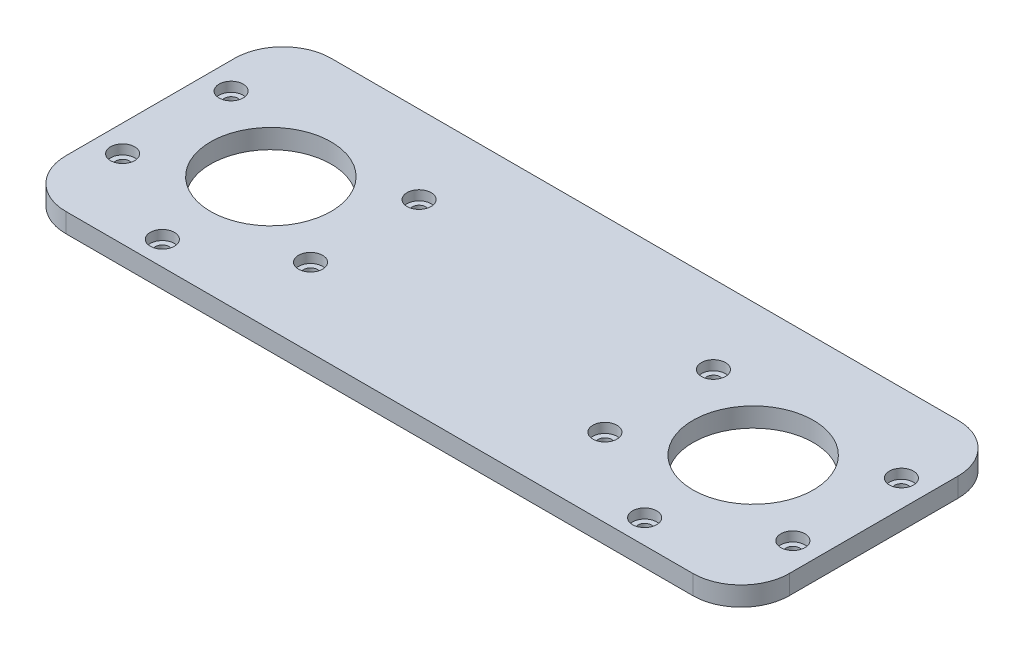
ISO-10303-21;
HEADER;
FILE_DESCRIPTION(('STEP AP214'),'2;1');
FILE_NAME('part.step','',(''),(''),'','','');
FILE_SCHEMA(('AUTOMOTIVE_DESIGN { 1 0 10303 214 1 1 1 1 }'));
ENDSEC;
DATA;
#1=APPLICATION_CONTEXT('core data for automotive mechanical design processes');
#2=APPLICATION_PROTOCOL_DEFINITION('international standard','automotive_design',2000,#1);
#3=PRODUCT_CONTEXT('',#1,'mechanical');
#4=PRODUCT('Part','Part','',(#3));
#5=PRODUCT_RELATED_PRODUCT_CATEGORY('part','',(#4));
#6=PRODUCT_DEFINITION_FORMATION('','',#4);
#7=PRODUCT_DEFINITION_CONTEXT('part definition',#1,'design');
#8=PRODUCT_DEFINITION('design','',#6,#7);
#9=PRODUCT_DEFINITION_SHAPE('','',#8);
#10=(LENGTH_UNIT() NAMED_UNIT(*) SI_UNIT(.MILLI.,.METRE.));
#11=(NAMED_UNIT(*) PLANE_ANGLE_UNIT() SI_UNIT($,.RADIAN.));
#12=(NAMED_UNIT(*) SI_UNIT($,.STERADIAN.) SOLID_ANGLE_UNIT());
#13=UNCERTAINTY_MEASURE_WITH_UNIT(LENGTH_MEASURE(1.E-05),#10,'distance_accuracy_value','');
#14=(GEOMETRIC_REPRESENTATION_CONTEXT(3) GLOBAL_UNCERTAINTY_ASSIGNED_CONTEXT((#13)) GLOBAL_UNIT_ASSIGNED_CONTEXT((#10,
#11,#12)) REPRESENTATION_CONTEXT('',''));
#15=CARTESIAN_POINT('',(0.,0.,0.));
#16=DIRECTION('',(0.,0.,1.));
#17=DIRECTION('',(1.,0.,0.));
#18=AXIS2_PLACEMENT_3D('',#15,#16,#17);
#19=CARTESIAN_POINT('',(-30.5144284148501,0.,-11.25));
#20=DIRECTION('',(0.,1.,0.));
#21=DIRECTION('',(0.,0.,1.));
#22=AXIS2_PLACEMENT_3D('',#19,#20,#21);
#23=CYLINDRICAL_SURFACE('',#22,1.4);
#24=CARTESIAN_POINT('',(-30.5144284148501,0.,-11.25));
#25=DIRECTION('',(0.,-1.,0.));
#26=DIRECTION('',(0.,0.,1.));
#27=AXIS2_PLACEMENT_3D('',#24,#25,#26);
#28=CIRCLE('',#27,1.4);
#29=CARTESIAN_POINT('',(-30.5144284148501,0.,-9.85000000000001));
#30=VERTEX_POINT('',#29);
#31=EDGE_CURVE('E251',#30,#30,#28,.T.);
#32=ORIENTED_EDGE('',*,*,#31,.T.);
#33=EDGE_LOOP('',(#32));
#34=FACE_BOUND('',#33,.T.);
#35=CARTESIAN_POINT('',(-30.5144284148501,2.,-11.25));
#36=DIRECTION('',(0.,1.,0.));
#37=DIRECTION('',(0.,0.,1.));
#38=AXIS2_PLACEMENT_3D('',#35,#36,#37);
#39=CIRCLE('',#38,1.4);
#40=CARTESIAN_POINT('',(-30.5144284148501,2.,-9.85000000000001));
#41=VERTEX_POINT('',#40);
#42=EDGE_CURVE('E175',#41,#41,#39,.T.);
#43=ORIENTED_EDGE('',*,*,#42,.T.);
#44=EDGE_LOOP('',(#43));
#45=FACE_BOUND('',#44,.T.);
#46=ADVANCED_FACE('F43',(#34,#45),#23,.F.);
#47=CARTESIAN_POINT('',(-69.4855715851498,0.,-11.2500000000001));
#48=DIRECTION('',(0.,1.,0.));
#49=DIRECTION('',(0.,0.,1.));
#50=AXIS2_PLACEMENT_3D('',#47,#48,#49);
#51=CYLINDRICAL_SURFACE('',#50,1.4);
#52=CARTESIAN_POINT('',(-69.4855715851498,0.,-11.2500000000001));
#53=DIRECTION('',(0.,-1.,0.));
#54=DIRECTION('',(0.,0.,1.));
#55=AXIS2_PLACEMENT_3D('',#52,#53,#54);
#56=CIRCLE('',#55,1.4);
#57=CARTESIAN_POINT('',(-69.4855715851498,0.,-9.85000000000013));
#58=VERTEX_POINT('',#57);
#59=EDGE_CURVE('E273',#58,#58,#56,.T.);
#60=ORIENTED_EDGE('',*,*,#59,.T.);
#61=EDGE_LOOP('',(#60));
#62=FACE_BOUND('',#61,.T.);
#63=CARTESIAN_POINT('',(-69.4855715851498,2.,-11.2500000000001));
#64=DIRECTION('',(0.,1.,0.));
#65=DIRECTION('',(0.,0.,1.));
#66=AXIS2_PLACEMENT_3D('',#63,#64,#65);
#67=CIRCLE('',#66,1.4);
#68=CARTESIAN_POINT('',(-69.4855715851498,2.,-9.85000000000013));
#69=VERTEX_POINT('',#68);
#70=EDGE_CURVE('E172',#69,#69,#67,.T.);
#71=ORIENTED_EDGE('',*,*,#70,.T.);
#72=EDGE_LOOP('',(#71));
#73=FACE_BOUND('',#72,.T.);
#74=ADVANCED_FACE('F333',(#62,#73),#51,.F.);
#75=CARTESIAN_POINT('',(-69.4855715851499,0.,11.2500000000001));
#76=DIRECTION('',(0.,1.,0.));
#77=DIRECTION('',(0.,0.,1.));
#78=AXIS2_PLACEMENT_3D('',#75,#76,#77);
#79=CYLINDRICAL_SURFACE('',#78,1.4);
#80=CARTESIAN_POINT('',(-69.4855715851499,0.,11.2500000000001));
#81=DIRECTION('',(0.,-1.,0.));
#82=DIRECTION('',(0.,0.,1.));
#83=AXIS2_PLACEMENT_3D('',#80,#81,#82);
#84=CIRCLE('',#83,1.4);
#85=CARTESIAN_POINT('',(-69.4855715851499,0.,12.6500000000001));
#86=VERTEX_POINT('',#85);
#87=EDGE_CURVE('E279',#86,#86,#84,.T.);
#88=ORIENTED_EDGE('',*,*,#87,.T.);
#89=EDGE_LOOP('',(#88));
#90=FACE_BOUND('',#89,.T.);
#91=CARTESIAN_POINT('',(-69.4855715851499,2.,11.2500000000001));
#92=DIRECTION('',(0.,1.,0.));
#93=DIRECTION('',(0.,0.,1.));
#94=AXIS2_PLACEMENT_3D('',#91,#92,#93);
#95=CIRCLE('',#94,1.4);
#96=CARTESIAN_POINT('',(-69.4855715851499,2.,12.6500000000001));
#97=VERTEX_POINT('',#96);
#98=EDGE_CURVE('E169',#97,#97,#95,.T.);
#99=ORIENTED_EDGE('',*,*,#98,.T.);
#100=EDGE_LOOP('',(#99));
#101=FACE_BOUND('',#100,.T.);
#102=ADVANCED_FACE('F340',(#90,#101),#79,.F.);
#103=CARTESIAN_POINT('',(-30.5144284148501,0.,11.25));
#104=DIRECTION('',(0.,1.,0.));
#105=DIRECTION('',(0.,0.,1.));
#106=AXIS2_PLACEMENT_3D('',#103,#104,#105);
#107=CYLINDRICAL_SURFACE('',#106,1.4);
#108=CARTESIAN_POINT('',(-30.5144284148501,0.,11.25));
#109=DIRECTION('',(0.,-1.,0.));
#110=DIRECTION('',(0.,0.,1.));
#111=AXIS2_PLACEMENT_3D('',#108,#109,#110);
#112=CIRCLE('',#111,1.4);
#113=CARTESIAN_POINT('',(-30.5144284148501,0.,12.65));
#114=VERTEX_POINT('',#113);
#115=EDGE_CURVE('E276',#114,#114,#112,.T.);
#116=ORIENTED_EDGE('',*,*,#115,.T.);
#117=EDGE_LOOP('',(#116));
#118=FACE_BOUND('',#117,.T.);
#119=CARTESIAN_POINT('',(-30.5144284148501,2.,11.25));
#120=DIRECTION('',(0.,1.,0.));
#121=DIRECTION('',(0.,0.,1.));
#122=AXIS2_PLACEMENT_3D('',#119,#120,#121);
#123=CIRCLE('',#122,1.4);
#124=CARTESIAN_POINT('',(-30.5144284148501,2.,12.65));
#125=VERTEX_POINT('',#124);
#126=EDGE_CURVE('E165',#125,#125,#123,.T.);
#127=ORIENTED_EDGE('',*,*,#126,.T.);
#128=EDGE_LOOP('',(#127));
#129=FACE_BOUND('',#128,.T.);
#130=ADVANCED_FACE('F603',(#118,#129),#107,.F.);
#131=CARTESIAN_POINT('',(-50.,0.,22.5));
#132=DIRECTION('',(0.,1.,0.));
#133=DIRECTION('',(0.,0.,1.));
#134=AXIS2_PLACEMENT_3D('',#131,#132,#133);
#135=CYLINDRICAL_SURFACE('',#134,1.4);
#136=CARTESIAN_POINT('',(-50.,0.,22.5));
#137=DIRECTION('',(0.,-1.,0.));
#138=DIRECTION('',(0.,0.,1.));
#139=AXIS2_PLACEMENT_3D('',#136,#137,#138);
#140=CIRCLE('',#139,1.4);
#141=CARTESIAN_POINT('',(-50.,0.,23.9));
#142=VERTEX_POINT('',#141);
#143=EDGE_CURVE('E178',#142,#142,#140,.T.);
#144=ORIENTED_EDGE('',*,*,#143,.T.);
#145=EDGE_LOOP('',(#144));
#146=FACE_BOUND('',#145,.T.);
#147=CARTESIAN_POINT('',(-50.,2.,22.5));
#148=DIRECTION('',(0.,1.,0.));
#149=DIRECTION('',(0.,0.,1.));
#150=AXIS2_PLACEMENT_3D('',#147,#148,#149);
#151=CIRCLE('',#150,1.4);
#152=CARTESIAN_POINT('',(-50.,2.,23.9));
#153=VERTEX_POINT('',#152);
#154=EDGE_CURVE('E162',#153,#153,#151,.T.);
#155=ORIENTED_EDGE('',*,*,#154,.T.);
#156=EDGE_LOOP('',(#155));
#157=FACE_BOUND('',#156,.T.);
#158=ADVANCED_FACE('F346',(#146,#157),#135,.F.);
#159=CARTESIAN_POINT('',(30.5144284148501,0.,-11.25));
#160=DIRECTION('',(0.,1.,0.));
#161=DIRECTION('',(0.,0.,1.));
#162=AXIS2_PLACEMENT_3D('',#159,#160,#161);
#163=CYLINDRICAL_SURFACE('',#162,1.4);
#164=CARTESIAN_POINT('',(30.5144284148501,0.,-11.25));
#165=DIRECTION('',(0.,1.,0.));
#166=DIRECTION('',(0.,0.,1.));
#167=AXIS2_PLACEMENT_3D('',#164,#165,#166);
#168=CIRCLE('',#167,1.4);
#169=CARTESIAN_POINT('',(30.5144284148501,0.,-9.85000000000001));
#170=VERTEX_POINT('',#169);
#171=EDGE_CURVE('E225',#170,#170,#168,.T.);
#172=ORIENTED_EDGE('',*,*,#171,.F.);
#173=EDGE_LOOP('',(#172));
#174=FACE_BOUND('',#173,.T.);
#175=CARTESIAN_POINT('',(30.5144284148501,2.,-11.25));
#176=DIRECTION('',(0.,1.,0.));
#177=DIRECTION('',(0.,0.,1.));
#178=AXIS2_PLACEMENT_3D('',#175,#176,#177);
#179=CIRCLE('',#178,1.4);
#180=CARTESIAN_POINT('',(30.5144284148501,2.,-9.85000000000001));
#181=VERTEX_POINT('',#180);
#182=EDGE_CURVE('E158',#181,#181,#179,.F.);
#183=ORIENTED_EDGE('',*,*,#182,.F.);
#184=EDGE_LOOP('',(#183));
#185=FACE_BOUND('',#184,.T.);
#186=ADVANCED_FACE('F393',(#174,#185),#163,.F.);
#187=CARTESIAN_POINT('',(69.4855715851498,0.,-11.2500000000001));
#188=DIRECTION('',(0.,1.,0.));
#189=DIRECTION('',(0.,0.,1.));
#190=AXIS2_PLACEMENT_3D('',#187,#188,#189);
#191=CYLINDRICAL_SURFACE('',#190,1.4);
#192=CARTESIAN_POINT('',(69.4855715851498,0.,-11.2500000000001));
#193=DIRECTION('',(0.,1.,0.));
#194=DIRECTION('',(0.,0.,1.));
#195=AXIS2_PLACEMENT_3D('',#192,#193,#194);
#196=CIRCLE('',#195,1.4);
#197=CARTESIAN_POINT('',(69.4855715851498,0.,-9.85000000000013));
#198=VERTEX_POINT('',#197);
#199=EDGE_CURVE('E230',#198,#198,#196,.T.);
#200=ORIENTED_EDGE('',*,*,#199,.F.);
#201=EDGE_LOOP('',(#200));
#202=FACE_BOUND('',#201,.T.);
#203=CARTESIAN_POINT('',(69.4855715851498,2.,-11.2500000000001));
#204=DIRECTION('',(0.,1.,0.));
#205=DIRECTION('',(0.,0.,1.));
#206=AXIS2_PLACEMENT_3D('',#203,#204,#205);
#207=CIRCLE('',#206,1.4);
#208=CARTESIAN_POINT('',(69.4855715851498,2.,-9.85000000000013));
#209=VERTEX_POINT('',#208);
#210=EDGE_CURVE('E155',#209,#209,#207,.F.);
#211=ORIENTED_EDGE('',*,*,#210,.F.);
#212=EDGE_LOOP('',(#211));
#213=FACE_BOUND('',#212,.T.);
#214=ADVANCED_FACE('F389',(#202,#213),#191,.F.);
#215=CARTESIAN_POINT('',(69.4855715851499,0.,11.2500000000001));
#216=DIRECTION('',(0.,1.,0.));
#217=DIRECTION('',(0.,0.,1.));
#218=AXIS2_PLACEMENT_3D('',#215,#216,#217);
#219=CYLINDRICAL_SURFACE('',#218,1.4);
#220=CARTESIAN_POINT('',(69.4855715851499,0.,11.2500000000001));
#221=DIRECTION('',(0.,1.,0.));
#222=DIRECTION('',(0.,0.,1.));
#223=AXIS2_PLACEMENT_3D('',#220,#221,#222);
#224=CIRCLE('',#223,1.4);
#225=CARTESIAN_POINT('',(69.4855715851499,0.,12.6500000000001));
#226=VERTEX_POINT('',#225);
#227=EDGE_CURVE('E236',#226,#226,#224,.T.);
#228=ORIENTED_EDGE('',*,*,#227,.F.);
#229=EDGE_LOOP('',(#228));
#230=FACE_BOUND('',#229,.T.);
#231=CARTESIAN_POINT('',(69.4855715851499,2.,11.2500000000001));
#232=DIRECTION('',(0.,1.,0.));
#233=DIRECTION('',(0.,0.,1.));
#234=AXIS2_PLACEMENT_3D('',#231,#232,#233);
#235=CIRCLE('',#234,1.4);
#236=CARTESIAN_POINT('',(69.4855715851499,2.,12.6500000000001));
#237=VERTEX_POINT('',#236);
#238=EDGE_CURVE('E152',#237,#237,#235,.F.);
#239=ORIENTED_EDGE('',*,*,#238,.F.);
#240=EDGE_LOOP('',(#239));
#241=FACE_BOUND('',#240,.T.);
#242=ADVANCED_FACE('F392',(#230,#241),#219,.F.);
#243=CARTESIAN_POINT('',(30.5144284148501,0.,11.25));
#244=DIRECTION('',(0.,1.,0.));
#245=DIRECTION('',(0.,0.,1.));
#246=AXIS2_PLACEMENT_3D('',#243,#244,#245);
#247=CYLINDRICAL_SURFACE('',#246,1.4);
#248=CARTESIAN_POINT('',(30.5144284148501,0.,11.25));
#249=DIRECTION('',(0.,1.,0.));
#250=DIRECTION('',(0.,0.,1.));
#251=AXIS2_PLACEMENT_3D('',#248,#249,#250);
#252=CIRCLE('',#251,1.4);
#253=CARTESIAN_POINT('',(30.5144284148501,0.,12.65));
#254=VERTEX_POINT('',#253);
#255=EDGE_CURVE('E233',#254,#254,#252,.T.);
#256=ORIENTED_EDGE('',*,*,#255,.F.);
#257=EDGE_LOOP('',(#256));
#258=FACE_BOUND('',#257,.T.);
#259=CARTESIAN_POINT('',(30.5144284148501,2.,11.25));
#260=DIRECTION('',(0.,1.,0.));
#261=DIRECTION('',(0.,0.,1.));
#262=AXIS2_PLACEMENT_3D('',#259,#260,#261);
#263=CIRCLE('',#262,1.4);
#264=CARTESIAN_POINT('',(30.5144284148501,2.,12.65));
#265=VERTEX_POINT('',#264);
#266=EDGE_CURVE('E148',#265,#265,#263,.F.);
#267=ORIENTED_EDGE('',*,*,#266,.F.);
#268=EDGE_LOOP('',(#267));
#269=FACE_BOUND('',#268,.T.);
#270=ADVANCED_FACE('F397',(#258,#269),#247,.F.);
#271=CARTESIAN_POINT('',(50.,0.,22.5));
#272=DIRECTION('',(0.,1.,0.));
#273=DIRECTION('',(0.,0.,1.));
#274=AXIS2_PLACEMENT_3D('',#271,#272,#273);
#275=CYLINDRICAL_SURFACE('',#274,1.4);
#276=CARTESIAN_POINT('',(50.,0.,22.5));
#277=DIRECTION('',(0.,1.,0.));
#278=DIRECTION('',(0.,0.,1.));
#279=AXIS2_PLACEMENT_3D('',#276,#277,#278);
#280=CIRCLE('',#279,1.4);
#281=CARTESIAN_POINT('',(50.,0.,23.9));
#282=VERTEX_POINT('',#281);
#283=EDGE_CURVE('E161',#282,#282,#280,.T.);
#284=ORIENTED_EDGE('',*,*,#283,.F.);
#285=EDGE_LOOP('',(#284));
#286=FACE_BOUND('',#285,.T.);
#287=CARTESIAN_POINT('',(50.,2.,22.5));
#288=DIRECTION('',(0.,1.,0.));
#289=DIRECTION('',(0.,0.,1.));
#290=AXIS2_PLACEMENT_3D('',#287,#288,#289);
#291=CIRCLE('',#290,1.4);
#292=CARTESIAN_POINT('',(50.,2.,23.9));
#293=VERTEX_POINT('',#292);
#294=EDGE_CURVE('E145',#293,#293,#291,.F.);
#295=ORIENTED_EDGE('',*,*,#294,.F.);
#296=EDGE_LOOP('',(#295));
#297=FACE_BOUND('',#296,.T.);
#298=ADVANCED_FACE('F401',(#286,#297),#275,.F.);
#299=CARTESIAN_POINT('',(0.,4.,0.));
#300=DIRECTION('',(0.,1.,0.));
#301=DIRECTION('',(0.,0.,1.));
#302=AXIS2_PLACEMENT_3D('',#299,#300,#301);
#303=PLANE('',#302);
#304=CARTESIAN_POINT('',(-69.4855715851498,4.,-11.2500000000001));
#305=DIRECTION('',(0.,-1.,0.));
#306=DIRECTION('',(0.,0.,1.));
#307=AXIS2_PLACEMENT_3D('',#304,#305,#306);
#308=CIRCLE('',#307,2.5);
#309=CARTESIAN_POINT('',(-69.4855715851498,4.,-8.75000000000014));
#310=VERTEX_POINT('',#309);
#311=EDGE_CURVE('E290',#310,#310,#308,.T.);
#312=ORIENTED_EDGE('',*,*,#311,.T.);
#313=EDGE_LOOP('',(#312));
#314=FACE_BOUND('',#313,.T.);
#315=CARTESIAN_POINT('',(-69.4855715851499,4.,11.2500000000001));
#316=DIRECTION('',(0.,-1.,0.));
#317=DIRECTION('',(0.,0.,1.));
#318=AXIS2_PLACEMENT_3D('',#315,#316,#317);
#319=CIRCLE('',#318,2.50000000000001);
#320=CARTESIAN_POINT('',(-69.4855715851499,4.,13.7500000000001));
#321=VERTEX_POINT('',#320);
#322=EDGE_CURVE('E296',#321,#321,#319,.T.);
#323=ORIENTED_EDGE('',*,*,#322,.T.);
#324=EDGE_LOOP('',(#323));
#325=FACE_BOUND('',#324,.T.);
#326=CARTESIAN_POINT('',(-50.,4.,22.5));
#327=DIRECTION('',(0.,-1.,0.));
#328=DIRECTION('',(0.,0.,1.));
#329=AXIS2_PLACEMENT_3D('',#326,#327,#328);
#330=CIRCLE('',#329,2.5);
#331=CARTESIAN_POINT('',(-50.,4.,25.));
#332=VERTEX_POINT('',#331);
#333=EDGE_CURVE('E302',#332,#332,#330,.T.);
#334=ORIENTED_EDGE('',*,*,#333,.T.);
#335=EDGE_LOOP('',(#334));
#336=FACE_BOUND('',#335,.T.);
#337=CARTESIAN_POINT('',(-30.5144284148501,4.,11.25));
#338=DIRECTION('',(0.,-1.,0.));
#339=DIRECTION('',(0.,0.,1.));
#340=AXIS2_PLACEMENT_3D('',#337,#338,#339);
#341=CIRCLE('',#340,2.5);
#342=CARTESIAN_POINT('',(-30.5144284148501,4.,13.75));
#343=VERTEX_POINT('',#342);
#344=EDGE_CURVE('E308',#343,#343,#341,.T.);
#345=ORIENTED_EDGE('',*,*,#344,.T.);
#346=EDGE_LOOP('',(#345));
#347=FACE_BOUND('',#346,.T.);
#348=CARTESIAN_POINT('',(-30.5144284148501,4.,-11.25));
#349=DIRECTION('',(0.,-1.,0.));
#350=DIRECTION('',(0.,0.,1.));
#351=AXIS2_PLACEMENT_3D('',#348,#349,#350);
#352=CIRCLE('',#351,2.5);
#353=CARTESIAN_POINT('',(-30.5144284148501,4.,-8.75000000000001));
#354=VERTEX_POINT('',#353);
#355=EDGE_CURVE('E284',#354,#354,#352,.T.);
#356=ORIENTED_EDGE('',*,*,#355,.T.);
#357=EDGE_LOOP('',(#356));
#358=FACE_BOUND('',#357,.T.);
#359=CARTESIAN_POINT('',(69.4855715851498,4.,-11.2500000000001));
#360=DIRECTION('',(0.,1.,0.));
#361=DIRECTION('',(0.,0.,1.));
#362=AXIS2_PLACEMENT_3D('',#359,#360,#361);
#363=CIRCLE('',#362,2.5);
#364=CARTESIAN_POINT('',(69.4855715851498,4.,-8.75000000000014));
#365=VERTEX_POINT('',#364);
#366=EDGE_CURVE('E250',#365,#365,#363,.T.);
#367=ORIENTED_EDGE('',*,*,#366,.F.);
#368=EDGE_LOOP('',(#367));
#369=FACE_BOUND('',#368,.T.);
#370=CARTESIAN_POINT('',(69.4855715851499,4.,11.2500000000001));
#371=DIRECTION('',(0.,1.,0.));
#372=DIRECTION('',(0.,0.,1.));
#373=AXIS2_PLACEMENT_3D('',#370,#371,#372);
#374=CIRCLE('',#373,2.50000000000001);
#375=CARTESIAN_POINT('',(69.4855715851499,4.,13.7500000000001));
#376=VERTEX_POINT('',#375);
#377=EDGE_CURVE('E257',#376,#376,#374,.T.);
#378=ORIENTED_EDGE('',*,*,#377,.F.);
#379=EDGE_LOOP('',(#378));
#380=FACE_BOUND('',#379,.T.);
#381=CARTESIAN_POINT('',(50.,4.,22.5));
#382=DIRECTION('',(0.,1.,0.));
#383=DIRECTION('',(0.,0.,1.));
#384=AXIS2_PLACEMENT_3D('',#381,#382,#383);
#385=CIRCLE('',#384,2.5);
#386=CARTESIAN_POINT('',(50.,4.,25.));
#387=VERTEX_POINT('',#386);
#388=EDGE_CURVE('E263',#387,#387,#385,.T.);
#389=ORIENTED_EDGE('',*,*,#388,.F.);
#390=EDGE_LOOP('',(#389));
#391=FACE_BOUND('',#390,.T.);
#392=CARTESIAN_POINT('',(30.5144284148501,4.,11.25));
#393=DIRECTION('',(0.,1.,0.));
#394=DIRECTION('',(0.,0.,1.));
#395=AXIS2_PLACEMENT_3D('',#392,#393,#394);
#396=CIRCLE('',#395,2.5);
#397=CARTESIAN_POINT('',(30.5144284148501,4.,13.75));
#398=VERTEX_POINT('',#397);
#399=EDGE_CURVE('E244',#398,#398,#396,.T.);
#400=ORIENTED_EDGE('',*,*,#399,.F.);
#401=EDGE_LOOP('',(#400));
#402=FACE_BOUND('',#401,.T.);
#403=CARTESIAN_POINT('',(30.5144284148501,4.,-11.25));
#404=DIRECTION('',(0.,1.,0.));
#405=DIRECTION('',(0.,0.,1.));
#406=AXIS2_PLACEMENT_3D('',#403,#404,#405);
#407=CIRCLE('',#406,2.5);
#408=CARTESIAN_POINT('',(30.5144284148501,4.,-8.75000000000001));
#409=VERTEX_POINT('',#408);
#410=EDGE_CURVE('E241',#409,#409,#407,.T.);
#411=ORIENTED_EDGE('',*,*,#410,.F.);
#412=EDGE_LOOP('',(#411));
#413=FACE_BOUND('',#412,.T.);
#414=CARTESIAN_POINT('',(-50.,4.,0.));
#415=DIRECTION('',(0.,1.,0.));
#416=DIRECTION('',(0.,0.,1.));
#417=AXIS2_PLACEMENT_3D('',#414,#415,#416);
#418=CIRCLE('',#417,12.5);
#419=CARTESIAN_POINT('',(-50.,4.,12.5));
#420=VERTEX_POINT('',#419);
#421=EDGE_CURVE('E208',#420,#420,#418,.T.);
#422=ORIENTED_EDGE('',*,*,#421,.F.);
#423=EDGE_LOOP('',(#422));
#424=FACE_BOUND('',#423,.T.);
#425=DIRECTION('',(0.,0.,-1.));
#426=VECTOR('',#425,1.);
#427=CARTESIAN_POINT('',(75.,4.,-27.5));
#428=LINE('',#427,#426);
#429=CARTESIAN_POINT('',(75.,4.,17.5));
#430=VERTEX_POINT('',#429);
#431=CARTESIAN_POINT('',(75.,4.,-17.5));
#432=VERTEX_POINT('',#431);
#433=EDGE_CURVE('E215',#430,#432,#428,.T.);
#434=ORIENTED_EDGE('',*,*,#433,.T.);
#435=CARTESIAN_POINT('',(65.,4.,-17.5));
#436=DIRECTION('',(0.,1.,0.));
#437=DIRECTION('',(0.,0.,1.));
#438=AXIS2_PLACEMENT_3D('',#435,#436,#437);
#439=CIRCLE('',#438,10.);
#440=CARTESIAN_POINT('',(65.,4.,-27.5));
#441=VERTEX_POINT('',#440);
#442=EDGE_CURVE('E192',#432,#441,#439,.T.);
#443=ORIENTED_EDGE('',*,*,#442,.T.);
#444=DIRECTION('',(-1.,0.,0.));
#445=VECTOR('',#444,1.);
#446=CARTESIAN_POINT('',(-75.,4.,-27.5));
#447=LINE('',#446,#445);
#448=CARTESIAN_POINT('',(-65.,4.,-27.5));
#449=VERTEX_POINT('',#448);
#450=EDGE_CURVE('E129',#441,#449,#447,.T.);
#451=ORIENTED_EDGE('',*,*,#450,.T.);
#452=CARTESIAN_POINT('',(-65.,4.,-17.5));
#453=DIRECTION('',(0.,1.,0.));
#454=DIRECTION('',(0.,0.,1.));
#455=AXIS2_PLACEMENT_3D('',#452,#453,#454);
#456=CIRCLE('',#455,10.);
#457=CARTESIAN_POINT('',(-75.,4.,-17.5));
#458=VERTEX_POINT('',#457);
#459=EDGE_CURVE('E187',#449,#458,#456,.T.);
#460=ORIENTED_EDGE('',*,*,#459,.T.);
#461=DIRECTION('',(0.,0.,1.));
#462=VECTOR('',#461,1.);
#463=CARTESIAN_POINT('',(-75.,4.,-27.5));
#464=LINE('',#463,#462);
#465=CARTESIAN_POINT('',(-75.,4.,17.5));
#466=VERTEX_POINT('',#465);
#467=EDGE_CURVE('E136',#458,#466,#464,.T.);
#468=ORIENTED_EDGE('',*,*,#467,.T.);
#469=CARTESIAN_POINT('',(-65.,4.,17.5));
#470=DIRECTION('',(0.,1.,0.));
#471=DIRECTION('',(0.,0.,1.));
#472=AXIS2_PLACEMENT_3D('',#469,#470,#471);
#473=CIRCLE('',#472,10.);
#474=CARTESIAN_POINT('',(-65.,4.,27.5));
#475=VERTEX_POINT('',#474);
#476=EDGE_CURVE('E65',#466,#475,#473,.T.);
#477=ORIENTED_EDGE('',*,*,#476,.T.);
#478=DIRECTION('',(1.,0.,0.));
#479=VECTOR('',#478,1.);
#480=CARTESIAN_POINT('',(-75.,4.,27.5));
#481=LINE('',#480,#479);
#482=CARTESIAN_POINT('',(65.,4.,27.5));
#483=VERTEX_POINT('',#482);
#484=EDGE_CURVE('E139',#475,#483,#481,.T.);
#485=ORIENTED_EDGE('',*,*,#484,.T.);
#486=CARTESIAN_POINT('',(65.,4.,17.5));
#487=DIRECTION('',(0.,1.,0.));
#488=DIRECTION('',(0.,0.,1.));
#489=AXIS2_PLACEMENT_3D('',#486,#487,#488);
#490=CIRCLE('',#489,10.);
#491=EDGE_CURVE('E190',#483,#430,#490,.T.);
#492=ORIENTED_EDGE('',*,*,#491,.T.);
#493=EDGE_LOOP('',(#434,#443,#451,#460,#468,#477,#485,#492));
#494=FACE_BOUND('',#493,.T.);
#495=CARTESIAN_POINT('',(50.,4.,0.));
#496=DIRECTION('',(0.,1.,0.));
#497=DIRECTION('',(0.,0.,1.));
#498=AXIS2_PLACEMENT_3D('',#495,#496,#497);
#499=CIRCLE('',#498,12.5);
#500=CARTESIAN_POINT('',(50.,4.,12.5));
#501=VERTEX_POINT('',#500);
#502=EDGE_CURVE('E220',#501,#501,#499,.T.);
#503=ORIENTED_EDGE('',*,*,#502,.F.);
#504=EDGE_LOOP('',(#503));
#505=FACE_BOUND('',#504,.T.);
#506=ADVANCED_FACE('F405',(#314,#325,#336,#347,#358,#369,#380,#391,#402,#413,#424,#494,#505),
#303,.T.);
#507=CARTESIAN_POINT('',(0.,0.,0.));
#508=DIRECTION('',(0.,1.,0.));
#509=DIRECTION('',(0.,0.,1.));
#510=AXIS2_PLACEMENT_3D('',#507,#508,#509);
#511=PLANE('',#510);
#512=ORIENTED_EDGE('',*,*,#143,.F.);
#513=EDGE_LOOP('',(#512));
#514=FACE_BOUND('',#513,.T.);
#515=ORIENTED_EDGE('',*,*,#115,.F.);
#516=EDGE_LOOP('',(#515));
#517=FACE_BOUND('',#516,.T.);
#518=ORIENTED_EDGE('',*,*,#87,.F.);
#519=EDGE_LOOP('',(#518));
#520=FACE_BOUND('',#519,.T.);
#521=ORIENTED_EDGE('',*,*,#59,.F.);
#522=EDGE_LOOP('',(#521));
#523=FACE_BOUND('',#522,.T.);
#524=ORIENTED_EDGE('',*,*,#31,.F.);
#525=EDGE_LOOP('',(#524));
#526=FACE_BOUND('',#525,.T.);
#527=ORIENTED_EDGE('',*,*,#283,.T.);
#528=EDGE_LOOP('',(#527));
#529=FACE_BOUND('',#528,.T.);
#530=ORIENTED_EDGE('',*,*,#255,.T.);
#531=EDGE_LOOP('',(#530));
#532=FACE_BOUND('',#531,.T.);
#533=ORIENTED_EDGE('',*,*,#227,.T.);
#534=EDGE_LOOP('',(#533));
#535=FACE_BOUND('',#534,.T.);
#536=ORIENTED_EDGE('',*,*,#199,.T.);
#537=EDGE_LOOP('',(#536));
#538=FACE_BOUND('',#537,.T.);
#539=ORIENTED_EDGE('',*,*,#171,.T.);
#540=EDGE_LOOP('',(#539));
#541=FACE_BOUND('',#540,.T.);
#542=DIRECTION('',(-1.,0.,0.));
#543=VECTOR('',#542,1.);
#544=CARTESIAN_POINT('',(-75.,0.,-27.5));
#545=LINE('',#544,#543);
#546=CARTESIAN_POINT('',(65.,0.,-27.5));
#547=VERTEX_POINT('',#546);
#548=CARTESIAN_POINT('',(-65.,0.,-27.5));
#549=VERTEX_POINT('',#548);
#550=EDGE_CURVE('E126',#547,#549,#545,.T.);
#551=ORIENTED_EDGE('',*,*,#550,.F.);
#552=CARTESIAN_POINT('',(65.,0.,-17.5));
#553=DIRECTION('',(0.,1.,0.));
#554=DIRECTION('',(0.,0.,1.));
#555=AXIS2_PLACEMENT_3D('',#552,#553,#554);
#556=CIRCLE('',#555,10.);
#557=CARTESIAN_POINT('',(75.,0.,-17.5));
#558=VERTEX_POINT('',#557);
#559=EDGE_CURVE('E109',#547,#558,#556,.F.);
#560=ORIENTED_EDGE('',*,*,#559,.T.);
#561=DIRECTION('',(0.,0.,-1.));
#562=VECTOR('',#561,1.);
#563=CARTESIAN_POINT('',(75.,0.,-27.5));
#564=LINE('',#563,#562);
#565=CARTESIAN_POINT('',(75.,0.,17.5));
#566=VERTEX_POINT('',#565);
#567=EDGE_CURVE('E137',#566,#558,#564,.T.);
#568=ORIENTED_EDGE('',*,*,#567,.F.);
#569=CARTESIAN_POINT('',(65.,0.,17.5));
#570=DIRECTION('',(0.,1.,0.));
#571=DIRECTION('',(0.,0.,1.));
#572=AXIS2_PLACEMENT_3D('',#569,#570,#571);
#573=CIRCLE('',#572,10.);
#574=CARTESIAN_POINT('',(65.,0.,27.5));
#575=VERTEX_POINT('',#574);
#576=EDGE_CURVE('E120',#566,#575,#573,.F.);
#577=ORIENTED_EDGE('',*,*,#576,.T.);
#578=DIRECTION('',(1.,0.,0.));
#579=VECTOR('',#578,1.);
#580=CARTESIAN_POINT('',(-75.,0.,27.5));
#581=LINE('',#580,#579);
#582=CARTESIAN_POINT('',(-65.,0.,27.5));
#583=VERTEX_POINT('',#582);
#584=EDGE_CURVE('E141',#583,#575,#581,.T.);
#585=ORIENTED_EDGE('',*,*,#584,.F.);
#586=CARTESIAN_POINT('',(-65.,0.,17.5));
#587=DIRECTION('',(0.,1.,0.));
#588=DIRECTION('',(0.,0.,1.));
#589=AXIS2_PLACEMENT_3D('',#586,#587,#588);
#590=CIRCLE('',#589,10.);
#591=CARTESIAN_POINT('',(-75.,0.,17.5));
#592=VERTEX_POINT('',#591);
#593=EDGE_CURVE('E181',#583,#592,#590,.F.);
#594=ORIENTED_EDGE('',*,*,#593,.T.);
#595=DIRECTION('',(0.,0.,1.));
#596=VECTOR('',#595,1.);
#597=CARTESIAN_POINT('',(-75.,0.,-27.5));
#598=LINE('',#597,#596);
#599=CARTESIAN_POINT('',(-75.,0.,-17.5));
#600=VERTEX_POINT('',#599);
#601=EDGE_CURVE('E203',#600,#592,#598,.T.);
#602=ORIENTED_EDGE('',*,*,#601,.F.);
#603=CARTESIAN_POINT('',(-65.,0.,-17.5));
#604=DIRECTION('',(0.,1.,0.));
#605=DIRECTION('',(0.,0.,1.));
#606=AXIS2_PLACEMENT_3D('',#603,#604,#605);
#607=CIRCLE('',#606,10.);
#608=EDGE_CURVE('E130',#600,#549,#607,.F.);
#609=ORIENTED_EDGE('',*,*,#608,.T.);
#610=EDGE_LOOP('',(#551,#560,#568,#577,#585,#594,#602,#609));
#611=FACE_BOUND('',#610,.T.);
#612=CARTESIAN_POINT('',(-50.,0.,0.));
#613=DIRECTION('',(0.,1.,0.));
#614=DIRECTION('',(0.,0.,1.));
#615=AXIS2_PLACEMENT_3D('',#612,#613,#614);
#616=CIRCLE('',#615,12.5);
#617=CARTESIAN_POINT('',(-50.,0.,12.5));
#618=VERTEX_POINT('',#617);
#619=EDGE_CURVE('E211',#618,#618,#616,.T.);
#620=ORIENTED_EDGE('',*,*,#619,.T.);
#621=EDGE_LOOP('',(#620));
#622=FACE_BOUND('',#621,.T.);
#623=CARTESIAN_POINT('',(50.,0.,0.));
#624=DIRECTION('',(0.,1.,0.));
#625=DIRECTION('',(0.,0.,1.));
#626=AXIS2_PLACEMENT_3D('',#623,#624,#625);
#627=CIRCLE('',#626,12.5);
#628=CARTESIAN_POINT('',(50.,0.,12.5));
#629=VERTEX_POINT('',#628);
#630=EDGE_CURVE('E222',#629,#629,#627,.T.);
#631=ORIENTED_EDGE('',*,*,#630,.T.);
#632=EDGE_LOOP('',(#631));
#633=FACE_BOUND('',#632,.T.);
#634=ADVANCED_FACE('F133',(#514,#517,#520,#523,#526,#529,#532,#535,#538,#541,#611,#622,#633),
#511,.F.);
#635=CARTESIAN_POINT('',(-75.,4.,-27.5));
#636=DIRECTION('',(1.,0.,0.));
#637=DIRECTION('',(0.,0.,-1.));
#638=AXIS2_PLACEMENT_3D('',#635,#636,#637);
#639=PLANE('',#638);
#640=ORIENTED_EDGE('',*,*,#601,.T.);
#641=DIRECTION('',(0.,-1.,0.));
#642=VECTOR('',#641,1.);
#643=CARTESIAN_POINT('',(-75.,4.,17.5));
#644=LINE('',#643,#642);
#645=EDGE_CURVE('E11',#592,#466,#644,.F.);
#646=ORIENTED_EDGE('',*,*,#645,.T.);
#647=ORIENTED_EDGE('',*,*,#467,.F.);
#648=DIRECTION('',(0.,-1.,0.));
#649=VECTOR('',#648,1.);
#650=CARTESIAN_POINT('',(-75.,4.,-17.5));
#651=LINE('',#650,#649);
#652=EDGE_CURVE('E51',#458,#600,#651,.T.);
#653=ORIENTED_EDGE('',*,*,#652,.T.);
#654=EDGE_LOOP('',(#640,#646,#647,#653));
#655=FACE_BOUND('',#654,.T.);
#656=ADVANCED_FACE('F202',(#655),#639,.F.);
#657=CARTESIAN_POINT('',(-75.,4.,27.5));
#658=DIRECTION('',(0.,0.,-1.));
#659=DIRECTION('',(-1.,0.,0.));
#660=AXIS2_PLACEMENT_3D('',#657,#658,#659);
#661=PLANE('',#660);
#662=ORIENTED_EDGE('',*,*,#584,.T.);
#663=DIRECTION('',(0.,-1.,0.));
#664=VECTOR('',#663,1.);
#665=CARTESIAN_POINT('',(65.,4.,27.5));
#666=LINE('',#665,#664);
#667=EDGE_CURVE('E58',#575,#483,#666,.F.);
#668=ORIENTED_EDGE('',*,*,#667,.T.);
#669=ORIENTED_EDGE('',*,*,#484,.F.);
#670=DIRECTION('',(0.,-1.,0.));
#671=VECTOR('',#670,1.);
#672=CARTESIAN_POINT('',(-65.,4.,27.5));
#673=LINE('',#672,#671);
#674=EDGE_CURVE('E194',#475,#583,#673,.T.);
#675=ORIENTED_EDGE('',*,*,#674,.T.);
#676=EDGE_LOOP('',(#662,#668,#669,#675));
#677=FACE_BOUND('',#676,.T.);
#678=ADVANCED_FACE('F428',(#677),#661,.F.);
#679=CARTESIAN_POINT('',(75.,4.,-27.5));
#680=DIRECTION('',(-1.,0.,0.));
#681=DIRECTION('',(0.,0.,1.));
#682=AXIS2_PLACEMENT_3D('',#679,#680,#681);
#683=PLANE('',#682);
#684=ORIENTED_EDGE('',*,*,#567,.T.);
#685=DIRECTION('',(0.,-1.,0.));
#686=VECTOR('',#685,1.);
#687=CARTESIAN_POINT('',(75.,4.,-17.5));
#688=LINE('',#687,#686);
#689=EDGE_CURVE('E114',#558,#432,#688,.F.);
#690=ORIENTED_EDGE('',*,*,#689,.T.);
#691=ORIENTED_EDGE('',*,*,#433,.F.);
#692=DIRECTION('',(0.,-1.,0.));
#693=VECTOR('',#692,1.);
#694=CARTESIAN_POINT('',(75.,4.,17.5));
#695=LINE('',#694,#693);
#696=EDGE_CURVE('E119',#430,#566,#695,.T.);
#697=ORIENTED_EDGE('',*,*,#696,.T.);
#698=EDGE_LOOP('',(#684,#690,#691,#697));
#699=FACE_BOUND('',#698,.T.);
#700=ADVANCED_FACE('F425',(#699),#683,.F.);
#701=CARTESIAN_POINT('',(-75.,4.,-27.5));
#702=DIRECTION('',(0.,0.,1.));
#703=DIRECTION('',(1.,0.,0.));
#704=AXIS2_PLACEMENT_3D('',#701,#702,#703);
#705=PLANE('',#704);
#706=ORIENTED_EDGE('',*,*,#450,.F.);
#707=DIRECTION('',(0.,-1.,0.));
#708=VECTOR('',#707,1.);
#709=CARTESIAN_POINT('',(65.,4.,-27.5));
#710=LINE('',#709,#708);
#711=EDGE_CURVE('E113',#441,#547,#710,.T.);
#712=ORIENTED_EDGE('',*,*,#711,.T.);
#713=ORIENTED_EDGE('',*,*,#550,.T.);
#714=DIRECTION('',(0.,-1.,0.));
#715=VECTOR('',#714,1.);
#716=CARTESIAN_POINT('',(-65.,4.,-27.5));
#717=LINE('',#716,#715);
#718=EDGE_CURVE('E131',#549,#449,#717,.F.);
#719=ORIENTED_EDGE('',*,*,#718,.T.);
#720=EDGE_LOOP('',(#706,#712,#713,#719));
#721=FACE_BOUND('',#720,.T.);
#722=ADVANCED_FACE('F125',(#721),#705,.F.);
#723=CARTESIAN_POINT('',(-50.,4.,0.));
#724=DIRECTION('',(0.,-1.,0.));
#725=DIRECTION('',(0.,0.,-1.));
#726=AXIS2_PLACEMENT_3D('',#723,#724,#725);
#727=CYLINDRICAL_SURFACE('',#726,12.5);
#728=ORIENTED_EDGE('',*,*,#421,.T.);
#729=EDGE_LOOP('',(#728));
#730=FACE_BOUND('',#729,.T.);
#731=ORIENTED_EDGE('',*,*,#619,.F.);
#732=EDGE_LOOP('',(#731));
#733=FACE_BOUND('',#732,.T.);
#734=ADVANCED_FACE('F412',(#730,#733),#727,.F.);
#735=CARTESIAN_POINT('',(50.,4.,0.));
#736=DIRECTION('',(0.,-1.,0.));
#737=DIRECTION('',(0.,0.,-1.));
#738=AXIS2_PLACEMENT_3D('',#735,#736,#737);
#739=CYLINDRICAL_SURFACE('',#738,12.5);
#740=ORIENTED_EDGE('',*,*,#502,.T.);
#741=EDGE_LOOP('',(#740));
#742=FACE_BOUND('',#741,.T.);
#743=ORIENTED_EDGE('',*,*,#630,.F.);
#744=EDGE_LOOP('',(#743));
#745=FACE_BOUND('',#744,.T.);
#746=ADVANCED_FACE('F364',(#742,#745),#739,.F.);
#747=CARTESIAN_POINT('',(50.,2.,22.5));
#748=DIRECTION('',(0.,1.,0.));
#749=DIRECTION('',(0.,0.,1.));
#750=AXIS2_PLACEMENT_3D('',#747,#748,#749);
#751=PLANE('',#750);
#752=CARTESIAN_POINT('',(50.,2.,22.5));
#753=DIRECTION('',(0.,1.,0.));
#754=DIRECTION('',(0.,0.,1.));
#755=AXIS2_PLACEMENT_3D('',#752,#753,#754);
#756=CIRCLE('',#755,2.5);
#757=CARTESIAN_POINT('',(50.,2.,25.));
#758=VERTEX_POINT('',#757);
#759=EDGE_CURVE('E260',#758,#758,#756,.T.);
#760=ORIENTED_EDGE('',*,*,#759,.T.);
#761=EDGE_LOOP('',(#760));
#762=FACE_BOUND('',#761,.T.);
#763=ORIENTED_EDGE('',*,*,#294,.T.);
#764=EDGE_LOOP('',(#763));
#765=FACE_BOUND('',#764,.T.);
#766=ADVANCED_FACE('F360',(#762,#765),#751,.T.);
#767=CARTESIAN_POINT('',(50.,2.,22.5));
#768=DIRECTION('',(0.,1.,0.));
#769=DIRECTION('',(0.,0.,1.));
#770=AXIS2_PLACEMENT_3D('',#767,#768,#769);
#771=CYLINDRICAL_SURFACE('',#770,2.5);
#772=ORIENTED_EDGE('',*,*,#759,.F.);
#773=EDGE_LOOP('',(#772));
#774=FACE_BOUND('',#773,.T.);
#775=ORIENTED_EDGE('',*,*,#388,.T.);
#776=EDGE_LOOP('',(#775));
#777=FACE_BOUND('',#776,.T.);
#778=ADVANCED_FACE('F356',(#774,#777),#771,.F.);
#779=CARTESIAN_POINT('',(30.5144284148501,2.,11.25));
#780=DIRECTION('',(0.,1.,0.));
#781=DIRECTION('',(0.,0.,1.));
#782=AXIS2_PLACEMENT_3D('',#779,#780,#781);
#783=PLANE('',#782);
#784=CARTESIAN_POINT('',(30.5144284148501,2.,11.25));
#785=DIRECTION('',(0.,1.,0.));
#786=DIRECTION('',(0.,0.,1.));
#787=AXIS2_PLACEMENT_3D('',#784,#785,#786);
#788=CIRCLE('',#787,2.5);
#789=CARTESIAN_POINT('',(30.5144284148501,2.,13.75));
#790=VERTEX_POINT('',#789);
#791=EDGE_CURVE('E266',#790,#790,#788,.T.);
#792=ORIENTED_EDGE('',*,*,#791,.T.);
#793=EDGE_LOOP('',(#792));
#794=FACE_BOUND('',#793,.T.);
#795=ORIENTED_EDGE('',*,*,#266,.T.);
#796=EDGE_LOOP('',(#795));
#797=FACE_BOUND('',#796,.T.);
#798=ADVANCED_FACE('F352',(#794,#797),#783,.T.);
#799=CARTESIAN_POINT('',(30.5144284148501,2.,11.25));
#800=DIRECTION('',(0.,1.,0.));
#801=DIRECTION('',(0.,0.,1.));
#802=AXIS2_PLACEMENT_3D('',#799,#800,#801);
#803=CYLINDRICAL_SURFACE('',#802,2.5);
#804=ORIENTED_EDGE('',*,*,#791,.F.);
#805=EDGE_LOOP('',(#804));
#806=FACE_BOUND('',#805,.T.);
#807=ORIENTED_EDGE('',*,*,#399,.T.);
#808=EDGE_LOOP('',(#807));
#809=FACE_BOUND('',#808,.T.);
#810=ADVANCED_FACE('F348',(#806,#809),#803,.F.);
#811=CARTESIAN_POINT('',(69.4855715851499,2.,11.2500000000001));
#812=DIRECTION('',(0.,1.,0.));
#813=DIRECTION('',(0.,0.,1.));
#814=AXIS2_PLACEMENT_3D('',#811,#812,#813);
#815=PLANE('',#814);
#816=CARTESIAN_POINT('',(69.4855715851499,2.,11.2500000000001));
#817=DIRECTION('',(0.,1.,0.));
#818=DIRECTION('',(0.,0.,1.));
#819=AXIS2_PLACEMENT_3D('',#816,#817,#818);
#820=CIRCLE('',#819,2.50000000000001);
#821=CARTESIAN_POINT('',(69.4855715851499,2.,13.7500000000001));
#822=VERTEX_POINT('',#821);
#823=EDGE_CURVE('E254',#822,#822,#820,.T.);
#824=ORIENTED_EDGE('',*,*,#823,.T.);
#825=EDGE_LOOP('',(#824));
#826=FACE_BOUND('',#825,.T.);
#827=ORIENTED_EDGE('',*,*,#238,.T.);
#828=EDGE_LOOP('',(#827));
#829=FACE_BOUND('',#828,.T.);
#830=ADVANCED_FACE('F351',(#826,#829),#815,.T.);
#831=CARTESIAN_POINT('',(69.4855715851499,2.,11.2500000000001));
#832=DIRECTION('',(0.,1.,0.));
#833=DIRECTION('',(0.,0.,1.));
#834=AXIS2_PLACEMENT_3D('',#831,#832,#833);
#835=CYLINDRICAL_SURFACE('',#834,2.50000000000001);
#836=ORIENTED_EDGE('',*,*,#823,.F.);
#837=EDGE_LOOP('',(#836));
#838=FACE_BOUND('',#837,.T.);
#839=ORIENTED_EDGE('',*,*,#377,.T.);
#840=EDGE_LOOP('',(#839));
#841=FACE_BOUND('',#840,.T.);
#842=ADVANCED_FACE('F366',(#838,#841),#835,.F.);
#843=CARTESIAN_POINT('',(69.4855715851498,2.,-11.2500000000001));
#844=DIRECTION('',(0.,1.,0.));
#845=DIRECTION('',(0.,0.,1.));
#846=AXIS2_PLACEMENT_3D('',#843,#844,#845);
#847=PLANE('',#846);
#848=CARTESIAN_POINT('',(69.4855715851498,2.,-11.2500000000001));
#849=DIRECTION('',(0.,1.,0.));
#850=DIRECTION('',(0.,0.,1.));
#851=AXIS2_PLACEMENT_3D('',#848,#849,#850);
#852=CIRCLE('',#851,2.5);
#853=CARTESIAN_POINT('',(69.4855715851498,2.,-8.75000000000014));
#854=VERTEX_POINT('',#853);
#855=EDGE_CURVE('E247',#854,#854,#852,.T.);
#856=ORIENTED_EDGE('',*,*,#855,.T.);
#857=EDGE_LOOP('',(#856));
#858=FACE_BOUND('',#857,.T.);
#859=ORIENTED_EDGE('',*,*,#210,.T.);
#860=EDGE_LOOP('',(#859));
#861=FACE_BOUND('',#860,.T.);
#862=ADVANCED_FACE('F369',(#858,#861),#847,.T.);
#863=CARTESIAN_POINT('',(69.4855715851498,2.,-11.2500000000001));
#864=DIRECTION('',(0.,1.,0.));
#865=DIRECTION('',(0.,0.,1.));
#866=AXIS2_PLACEMENT_3D('',#863,#864,#865);
#867=CYLINDRICAL_SURFACE('',#866,2.5);
#868=ORIENTED_EDGE('',*,*,#855,.F.);
#869=EDGE_LOOP('',(#868));
#870=FACE_BOUND('',#869,.T.);
#871=ORIENTED_EDGE('',*,*,#366,.T.);
#872=EDGE_LOOP('',(#871));
#873=FACE_BOUND('',#872,.T.);
#874=ADVANCED_FACE('F374',(#870,#873),#867,.F.);
#875=CARTESIAN_POINT('',(30.5144284148501,2.,-11.25));
#876=DIRECTION('',(0.,1.,0.));
#877=DIRECTION('',(0.,0.,1.));
#878=AXIS2_PLACEMENT_3D('',#875,#876,#877);
#879=PLANE('',#878);
#880=CARTESIAN_POINT('',(30.5144284148501,2.,-11.25));
#881=DIRECTION('',(0.,1.,0.));
#882=DIRECTION('',(0.,0.,1.));
#883=AXIS2_PLACEMENT_3D('',#880,#881,#882);
#884=CIRCLE('',#883,2.5);
#885=CARTESIAN_POINT('',(30.5144284148501,2.,-8.75000000000001));
#886=VERTEX_POINT('',#885);
#887=EDGE_CURVE('E149',#886,#886,#884,.T.);
#888=ORIENTED_EDGE('',*,*,#887,.T.);
#889=EDGE_LOOP('',(#888));
#890=FACE_BOUND('',#889,.T.);
#891=ORIENTED_EDGE('',*,*,#182,.T.);
#892=EDGE_LOOP('',(#891));
#893=FACE_BOUND('',#892,.T.);
#894=ADVANCED_FACE('F377',(#890,#893),#879,.T.);
#895=CARTESIAN_POINT('',(30.5144284148501,2.,-11.25));
#896=DIRECTION('',(0.,1.,0.));
#897=DIRECTION('',(0.,0.,1.));
#898=AXIS2_PLACEMENT_3D('',#895,#896,#897);
#899=CYLINDRICAL_SURFACE('',#898,2.5);
#900=ORIENTED_EDGE('',*,*,#887,.F.);
#901=EDGE_LOOP('',(#900));
#902=FACE_BOUND('',#901,.T.);
#903=ORIENTED_EDGE('',*,*,#410,.T.);
#904=EDGE_LOOP('',(#903));
#905=FACE_BOUND('',#904,.T.);
#906=ADVANCED_FACE('F384',(#902,#905),#899,.F.);
#907=CARTESIAN_POINT('',(-50.,2.,22.5));
#908=DIRECTION('',(0.,1.,0.));
#909=DIRECTION('',(0.,0.,1.));
#910=AXIS2_PLACEMENT_3D('',#907,#908,#909);
#911=CYLINDRICAL_SURFACE('',#910,2.5);
#912=CARTESIAN_POINT('',(-50.,2.,22.5));
#913=DIRECTION('',(0.,-1.,0.));
#914=DIRECTION('',(0.,0.,1.));
#915=AXIS2_PLACEMENT_3D('',#912,#913,#914);
#916=CIRCLE('',#915,2.5);
#917=CARTESIAN_POINT('',(-50.,2.,25.));
#918=VERTEX_POINT('',#917);
#919=EDGE_CURVE('E305',#918,#918,#916,.T.);
#920=ORIENTED_EDGE('',*,*,#919,.T.);
#921=EDGE_LOOP('',(#920));
#922=FACE_BOUND('',#921,.T.);
#923=ORIENTED_EDGE('',*,*,#333,.F.);
#924=EDGE_LOOP('',(#923));
#925=FACE_BOUND('',#924,.T.);
#926=ADVANCED_FACE('F387',(#922,#925),#911,.F.);
#927=CARTESIAN_POINT('',(-50.,2.,22.5));
#928=DIRECTION('',(0.,1.,0.));
#929=DIRECTION('',(0.,0.,1.));
#930=AXIS2_PLACEMENT_3D('',#927,#928,#929);
#931=PLANE('',#930);
#932=ORIENTED_EDGE('',*,*,#154,.F.);
#933=EDGE_LOOP('',(#932));
#934=FACE_BOUND('',#933,.T.);
#935=ORIENTED_EDGE('',*,*,#919,.F.);
#936=EDGE_LOOP('',(#935));
#937=FACE_BOUND('',#936,.T.);
#938=ADVANCED_FACE('F329',(#934,#937),#931,.T.);
#939=CARTESIAN_POINT('',(-30.5144284148501,2.,11.25));
#940=DIRECTION('',(0.,1.,0.));
#941=DIRECTION('',(0.,0.,1.));
#942=AXIS2_PLACEMENT_3D('',#939,#940,#941);
#943=CYLINDRICAL_SURFACE('',#942,2.5);
#944=CARTESIAN_POINT('',(-30.5144284148501,2.,11.25));
#945=DIRECTION('',(0.,-1.,0.));
#946=DIRECTION('',(0.,0.,1.));
#947=AXIS2_PLACEMENT_3D('',#944,#945,#946);
#948=CIRCLE('',#947,2.5);
#949=CARTESIAN_POINT('',(-30.5144284148501,2.,13.75));
#950=VERTEX_POINT('',#949);
#951=EDGE_CURVE('E287',#950,#950,#948,.T.);
#952=ORIENTED_EDGE('',*,*,#951,.T.);
#953=EDGE_LOOP('',(#952));
#954=FACE_BOUND('',#953,.T.);
#955=ORIENTED_EDGE('',*,*,#344,.F.);
#956=EDGE_LOOP('',(#955));
#957=FACE_BOUND('',#956,.T.);
#958=ADVANCED_FACE('F314',(#954,#957),#943,.F.);
#959=CARTESIAN_POINT('',(-30.5144284148501,2.,11.25));
#960=DIRECTION('',(0.,1.,0.));
#961=DIRECTION('',(0.,0.,1.));
#962=AXIS2_PLACEMENT_3D('',#959,#960,#961);
#963=PLANE('',#962);
#964=ORIENTED_EDGE('',*,*,#126,.F.);
#965=EDGE_LOOP('',(#964));
#966=FACE_BOUND('',#965,.T.);
#967=ORIENTED_EDGE('',*,*,#951,.F.);
#968=EDGE_LOOP('',(#967));
#969=FACE_BOUND('',#968,.T.);
#970=ADVANCED_FACE('F317',(#966,#969),#963,.T.);
#971=CARTESIAN_POINT('',(-69.4855715851499,2.,11.2500000000001));
#972=DIRECTION('',(0.,1.,0.));
#973=DIRECTION('',(0.,0.,1.));
#974=AXIS2_PLACEMENT_3D('',#971,#972,#973);
#975=CYLINDRICAL_SURFACE('',#974,2.50000000000001);
#976=CARTESIAN_POINT('',(-69.4855715851499,2.,11.2500000000001));
#977=DIRECTION('',(0.,-1.,0.));
#978=DIRECTION('',(0.,0.,1.));
#979=AXIS2_PLACEMENT_3D('',#976,#977,#978);
#980=CIRCLE('',#979,2.50000000000001);
#981=CARTESIAN_POINT('',(-69.4855715851499,2.,13.7500000000001));
#982=VERTEX_POINT('',#981);
#983=EDGE_CURVE('E299',#982,#982,#980,.T.);
#984=ORIENTED_EDGE('',*,*,#983,.T.);
#985=EDGE_LOOP('',(#984));
#986=FACE_BOUND('',#985,.T.);
#987=ORIENTED_EDGE('',*,*,#322,.F.);
#988=EDGE_LOOP('',(#987));
#989=FACE_BOUND('',#988,.T.);
#990=ADVANCED_FACE('F319',(#986,#989),#975,.F.);
#991=CARTESIAN_POINT('',(-69.4855715851499,2.,11.2500000000001));
#992=DIRECTION('',(0.,1.,0.));
#993=DIRECTION('',(0.,0.,1.));
#994=AXIS2_PLACEMENT_3D('',#991,#992,#993);
#995=PLANE('',#994);
#996=ORIENTED_EDGE('',*,*,#98,.F.);
#997=EDGE_LOOP('',(#996));
#998=FACE_BOUND('',#997,.T.);
#999=ORIENTED_EDGE('',*,*,#983,.F.);
#1000=EDGE_LOOP('',(#999));
#1001=FACE_BOUND('',#1000,.T.);
#1002=ADVANCED_FACE('F326',(#998,#1001),#995,.T.);
#1003=CARTESIAN_POINT('',(-69.4855715851498,2.,-11.2500000000001));
#1004=DIRECTION('',(0.,1.,0.));
#1005=DIRECTION('',(0.,0.,1.));
#1006=AXIS2_PLACEMENT_3D('',#1003,#1004,#1005);
#1007=CYLINDRICAL_SURFACE('',#1006,2.5);
#1008=CARTESIAN_POINT('',(-69.4855715851498,2.,-11.2500000000001));
#1009=DIRECTION('',(0.,-1.,0.));
#1010=DIRECTION('',(0.,0.,1.));
#1011=AXIS2_PLACEMENT_3D('',#1008,#1009,#1010);
#1012=CIRCLE('',#1011,2.5);
#1013=CARTESIAN_POINT('',(-69.4855715851498,2.,-8.75000000000014));
#1014=VERTEX_POINT('',#1013);
#1015=EDGE_CURVE('E293',#1014,#1014,#1012,.T.);
#1016=ORIENTED_EDGE('',*,*,#1015,.T.);
#1017=EDGE_LOOP('',(#1016));
#1018=FACE_BOUND('',#1017,.T.);
#1019=ORIENTED_EDGE('',*,*,#311,.F.);
#1020=EDGE_LOOP('',(#1019));
#1021=FACE_BOUND('',#1020,.T.);
#1022=ADVANCED_FACE('F532',(#1018,#1021),#1007,.F.);
#1023=CARTESIAN_POINT('',(-69.4855715851498,2.,-11.2500000000001));
#1024=DIRECTION('',(0.,1.,0.));
#1025=DIRECTION('',(0.,0.,1.));
#1026=AXIS2_PLACEMENT_3D('',#1023,#1024,#1025);
#1027=PLANE('',#1026);
#1028=ORIENTED_EDGE('',*,*,#70,.F.);
#1029=EDGE_LOOP('',(#1028));
#1030=FACE_BOUND('',#1029,.T.);
#1031=ORIENTED_EDGE('',*,*,#1015,.F.);
#1032=EDGE_LOOP('',(#1031));
#1033=FACE_BOUND('',#1032,.T.);
#1034=ADVANCED_FACE('F521',(#1030,#1033),#1027,.T.);
#1035=CARTESIAN_POINT('',(-30.5144284148501,2.,-11.25));
#1036=DIRECTION('',(0.,1.,0.));
#1037=DIRECTION('',(0.,0.,1.));
#1038=AXIS2_PLACEMENT_3D('',#1035,#1036,#1037);
#1039=CYLINDRICAL_SURFACE('',#1038,2.5);
#1040=CARTESIAN_POINT('',(-30.5144284148501,2.,-11.25));
#1041=DIRECTION('',(0.,-1.,0.));
#1042=DIRECTION('',(0.,0.,1.));
#1043=AXIS2_PLACEMENT_3D('',#1040,#1041,#1042);
#1044=CIRCLE('',#1043,2.5);
#1045=CARTESIAN_POINT('',(-30.5144284148501,2.,-8.75000000000001));
#1046=VERTEX_POINT('',#1045);
#1047=EDGE_CURVE('E166',#1046,#1046,#1044,.T.);
#1048=ORIENTED_EDGE('',*,*,#1047,.T.);
#1049=EDGE_LOOP('',(#1048));
#1050=FACE_BOUND('',#1049,.T.);
#1051=ORIENTED_EDGE('',*,*,#355,.F.);
#1052=EDGE_LOOP('',(#1051));
#1053=FACE_BOUND('',#1052,.T.);
#1054=ADVANCED_FACE('F510',(#1050,#1053),#1039,.F.);
#1055=CARTESIAN_POINT('',(-30.5144284148501,2.,-11.25));
#1056=DIRECTION('',(0.,1.,0.));
#1057=DIRECTION('',(0.,0.,1.));
#1058=AXIS2_PLACEMENT_3D('',#1055,#1056,#1057);
#1059=PLANE('',#1058);
#1060=ORIENTED_EDGE('',*,*,#42,.F.);
#1061=EDGE_LOOP('',(#1060));
#1062=FACE_BOUND('',#1061,.T.);
#1063=ORIENTED_EDGE('',*,*,#1047,.F.);
#1064=EDGE_LOOP('',(#1063));
#1065=FACE_BOUND('',#1064,.T.);
#1066=ADVANCED_FACE('F437',(#1062,#1065),#1059,.T.);
#1067=CARTESIAN_POINT('',(65.,4.,-17.5));
#1068=DIRECTION('',(0.,-1.,0.));
#1069=DIRECTION('',(0.,0.,-1.));
#1070=AXIS2_PLACEMENT_3D('',#1067,#1068,#1069);
#1071=CYLINDRICAL_SURFACE('',#1070,10.);
#1072=ORIENTED_EDGE('',*,*,#442,.F.);
#1073=ORIENTED_EDGE('',*,*,#689,.F.);
#1074=ORIENTED_EDGE('',*,*,#559,.F.);
#1075=ORIENTED_EDGE('',*,*,#711,.F.);
#1076=EDGE_LOOP('',(#1072,#1073,#1074,#1075));
#1077=FACE_BOUND('',#1076,.T.);
#1078=ADVANCED_FACE('F112',(#1077),#1071,.T.);
#1079=CARTESIAN_POINT('',(65.,4.,17.5));
#1080=DIRECTION('',(0.,-1.,0.));
#1081=DIRECTION('',(0.,0.,-1.));
#1082=AXIS2_PLACEMENT_3D('',#1079,#1080,#1081);
#1083=CYLINDRICAL_SURFACE('',#1082,10.);
#1084=ORIENTED_EDGE('',*,*,#491,.F.);
#1085=ORIENTED_EDGE('',*,*,#667,.F.);
#1086=ORIENTED_EDGE('',*,*,#576,.F.);
#1087=ORIENTED_EDGE('',*,*,#696,.F.);
#1088=EDGE_LOOP('',(#1084,#1085,#1086,#1087));
#1089=FACE_BOUND('',#1088,.T.);
#1090=ADVANCED_FACE('F436',(#1089),#1083,.T.);
#1091=CARTESIAN_POINT('',(-65.,4.,17.5));
#1092=DIRECTION('',(0.,-1.,0.));
#1093=DIRECTION('',(0.,0.,-1.));
#1094=AXIS2_PLACEMENT_3D('',#1091,#1092,#1093);
#1095=CYLINDRICAL_SURFACE('',#1094,10.);
#1096=ORIENTED_EDGE('',*,*,#476,.F.);
#1097=ORIENTED_EDGE('',*,*,#645,.F.);
#1098=ORIENTED_EDGE('',*,*,#593,.F.);
#1099=ORIENTED_EDGE('',*,*,#674,.F.);
#1100=EDGE_LOOP('',(#1096,#1097,#1098,#1099));
#1101=FACE_BOUND('',#1100,.T.);
#1102=ADVANCED_FACE('F439',(#1101),#1095,.T.);
#1103=CARTESIAN_POINT('',(-65.,4.,-17.5));
#1104=DIRECTION('',(0.,-1.,0.));
#1105=DIRECTION('',(0.,0.,-1.));
#1106=AXIS2_PLACEMENT_3D('',#1103,#1104,#1105);
#1107=CYLINDRICAL_SURFACE('',#1106,10.);
#1108=ORIENTED_EDGE('',*,*,#459,.F.);
#1109=ORIENTED_EDGE('',*,*,#718,.F.);
#1110=ORIENTED_EDGE('',*,*,#608,.F.);
#1111=ORIENTED_EDGE('',*,*,#652,.F.);
#1112=EDGE_LOOP('',(#1108,#1109,#1110,#1111));
#1113=FACE_BOUND('',#1112,.T.);
#1114=ADVANCED_FACE('F45',(#1113),#1107,.T.);
#1115=CLOSED_SHELL('',(#46,#74,#102,#130,#158,#186,#214,#242,#270,#298,#506,#634,#656,#678,#700,
#722,#734,#746,#766,#778,#798,#810,#830,#842,#862,#874,#894,#906,#926,#938,#958,#970,#990,#1002,
#1022,#1034,#1054,#1066,#1078,#1090,#1102,#1114));
#1116=MANIFOLD_SOLID_BREP('B2',#1115);
#1117=ADVANCED_BREP_SHAPE_REPRESENTATION('',(#18,#1116),#14);
#1118=SHAPE_DEFINITION_REPRESENTATION(#9,#1117);
ENDSEC;
END-ISO-10303-21;
